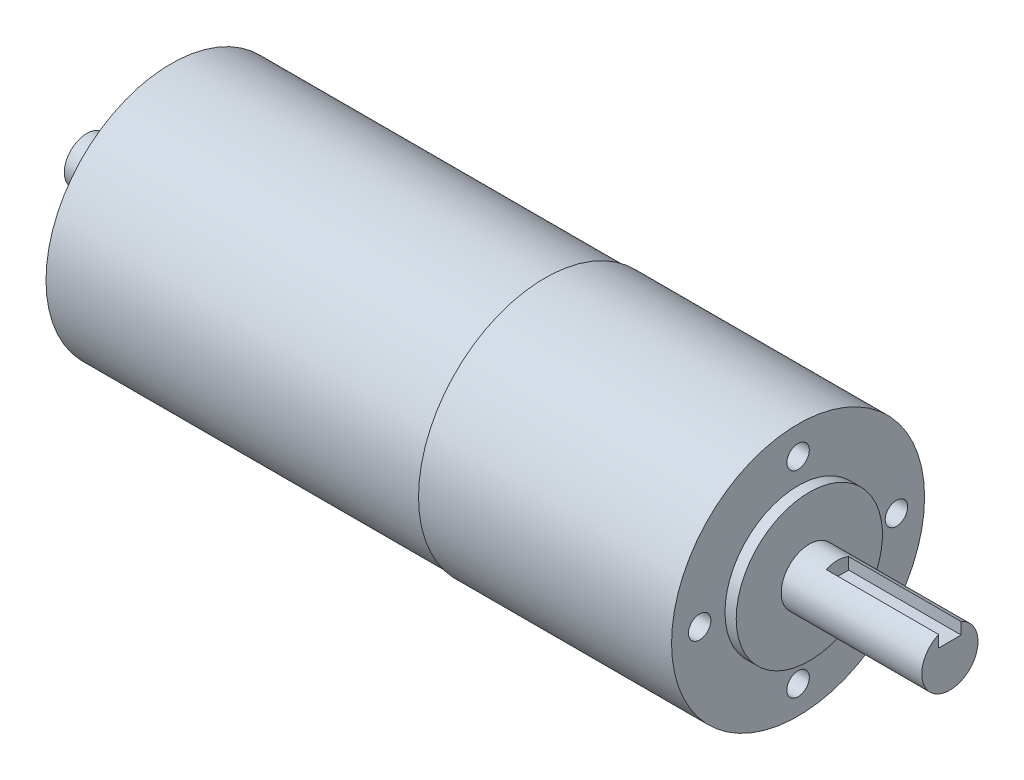
ISO-10303-21;
HEADER;
FILE_DESCRIPTION(('STEP AP214'),'2;1');
FILE_NAME('part.step','',(''),(''),'','','');
FILE_SCHEMA(('AUTOMOTIVE_DESIGN { 1 0 10303 214 1 1 1 1 }'));
ENDSEC;
DATA;
#1=APPLICATION_CONTEXT('core data for automotive mechanical design processes');
#2=APPLICATION_PROTOCOL_DEFINITION('international standard','automotive_design',2000,#1);
#3=PRODUCT_CONTEXT('',#1,'mechanical');
#4=PRODUCT('Part','Part','',(#3));
#5=PRODUCT_RELATED_PRODUCT_CATEGORY('part','',(#4));
#6=PRODUCT_DEFINITION_FORMATION('','',#4);
#7=PRODUCT_DEFINITION_CONTEXT('part definition',#1,'design');
#8=PRODUCT_DEFINITION('design','',#6,#7);
#9=PRODUCT_DEFINITION_SHAPE('','',#8);
#10=(LENGTH_UNIT() NAMED_UNIT(*) SI_UNIT(.MILLI.,.METRE.));
#11=(NAMED_UNIT(*) PLANE_ANGLE_UNIT() SI_UNIT($,.RADIAN.));
#12=(NAMED_UNIT(*) SI_UNIT($,.STERADIAN.) SOLID_ANGLE_UNIT());
#13=UNCERTAINTY_MEASURE_WITH_UNIT(LENGTH_MEASURE(1.E-05),#10,'distance_accuracy_value','');
#14=(GEOMETRIC_REPRESENTATION_CONTEXT(3) GLOBAL_UNCERTAINTY_ASSIGNED_CONTEXT((#13)) GLOBAL_UNIT_ASSIGNED_CONTEXT((#10,
#11,#12)) REPRESENTATION_CONTEXT('',''));
#15=CARTESIAN_POINT('',(0.,0.,0.));
#16=DIRECTION('',(0.,0.,1.));
#17=DIRECTION('',(1.,0.,0.));
#18=AXIS2_PLACEMENT_3D('',#15,#16,#17);
#19=CARTESIAN_POINT('',(-25.,0.,0.));
#20=DIRECTION('',(1.,0.,0.));
#21=DIRECTION('',(0.,0.,-1.));
#22=AXIS2_PLACEMENT_3D('',#19,#20,#21);
#23=CYLINDRICAL_SURFACE('',#22,5.);
#24=DIRECTION('',(1.,0.,0.));
#25=VECTOR('',#24,1.);
#26=CARTESIAN_POINT('',(-25.,4.58257569495584,-2.));
#27=LINE('',#26,#25);
#28=CARTESIAN_POINT('',(0.,4.58257569495584,-2.));
#29=VERTEX_POINT('',#28);
#30=CARTESIAN_POINT('',(-20.,4.58257569495584,-2.));
#31=VERTEX_POINT('',#30);
#32=EDGE_CURVE('E54',#29,#31,#27,.F.);
#33=ORIENTED_EDGE('',*,*,#32,.F.);
#34=CARTESIAN_POINT('',(0.,0.,0.));
#35=DIRECTION('',(1.,0.,0.));
#36=DIRECTION('',(0.,0.,-1.));
#37=AXIS2_PLACEMENT_3D('',#34,#35,#36);
#38=CIRCLE('',#37,5.);
#39=CARTESIAN_POINT('',(0.,4.58257569495584,2.));
#40=VERTEX_POINT('',#39);
#41=EDGE_CURVE('E142',#40,#29,#38,.T.);
#42=ORIENTED_EDGE('',*,*,#41,.F.);
#43=DIRECTION('',(1.,0.,0.));
#44=VECTOR('',#43,1.);
#45=CARTESIAN_POINT('',(-25.,4.58257569495584,2.));
#46=LINE('',#45,#44);
#47=CARTESIAN_POINT('',(-20.,4.58257569495584,2.));
#48=VERTEX_POINT('',#47);
#49=EDGE_CURVE('E46',#48,#40,#46,.T.);
#50=ORIENTED_EDGE('',*,*,#49,.F.);
#51=CARTESIAN_POINT('',(-20.,0.,0.));
#52=DIRECTION('',(1.,0.,0.));
#53=DIRECTION('',(0.,0.,-1.));
#54=AXIS2_PLACEMENT_3D('',#51,#52,#53);
#55=CIRCLE('',#54,5.);
#56=EDGE_CURVE('E11',#48,#31,#55,.F.);
#57=ORIENTED_EDGE('',*,*,#56,.T.);
#58=EDGE_LOOP('',(#33,#42,#50,#57));
#59=FACE_BOUND('',#58,.T.);
#60=CARTESIAN_POINT('',(-25.,0.,0.));
#61=DIRECTION('',(1.,0.,0.));
#62=DIRECTION('',(0.,0.,-1.));
#63=AXIS2_PLACEMENT_3D('',#60,#61,#62);
#64=CIRCLE('',#63,5.);
#65=CARTESIAN_POINT('',(-25.,0.,-5.));
#66=VERTEX_POINT('',#65);
#67=EDGE_CURVE('E152',#66,#66,#64,.T.);
#68=ORIENTED_EDGE('',*,*,#67,.T.);
#69=EDGE_LOOP('',(#68));
#70=FACE_BOUND('',#69,.T.);
#71=ADVANCED_FACE('F32',(#59,#70),#23,.T.);
#72=CARTESIAN_POINT('',(0.,0.,0.));
#73=DIRECTION('',(1.,0.,0.));
#74=DIRECTION('',(0.,0.,-1.));
#75=AXIS2_PLACEMENT_3D('',#72,#73,#74);
#76=PLANE('',#75);
#77=DIRECTION('',(0.,1.,0.));
#78=VECTOR('',#77,1.);
#79=CARTESIAN_POINT('',(0.,5.,-2.));
#80=LINE('',#79,#78);
#81=CARTESIAN_POINT('',(0.,2.5,-2.));
#82=VERTEX_POINT('',#81);
#83=EDGE_CURVE('E92',#82,#29,#80,.T.);
#84=ORIENTED_EDGE('',*,*,#83,.F.);
#85=DIRECTION('',(0.,0.,-1.));
#86=VECTOR('',#85,1.);
#87=CARTESIAN_POINT('',(0.,2.5,2.));
#88=LINE('',#87,#86);
#89=CARTESIAN_POINT('',(0.,2.5,2.));
#90=VERTEX_POINT('',#89);
#91=EDGE_CURVE('E94',#90,#82,#88,.T.);
#92=ORIENTED_EDGE('',*,*,#91,.F.);
#93=DIRECTION('',(0.,-1.,0.));
#94=VECTOR('',#93,1.);
#95=CARTESIAN_POINT('',(0.,0.,2.));
#96=LINE('',#95,#94);
#97=EDGE_CURVE('E39',#40,#90,#96,.T.);
#98=ORIENTED_EDGE('',*,*,#97,.F.);
#99=ORIENTED_EDGE('',*,*,#41,.T.);
#100=EDGE_LOOP('',(#84,#92,#98,#99));
#101=FACE_BOUND('',#100,.T.);
#102=ADVANCED_FACE('F161',(#101),#76,.T.);
#103=CARTESIAN_POINT('',(-27.,0.,0.));
#104=DIRECTION('',(1.,0.,0.));
#105=DIRECTION('',(0.,0.,-1.));
#106=AXIS2_PLACEMENT_3D('',#103,#104,#105);
#107=CYLINDRICAL_SURFACE('',#106,13.);
#108=CARTESIAN_POINT('',(-27.,0.,0.));
#109=DIRECTION('',(-1.,0.,0.));
#110=DIRECTION('',(0.,0.,1.));
#111=AXIS2_PLACEMENT_3D('',#108,#109,#110);
#112=CIRCLE('',#111,13.);
#113=CARTESIAN_POINT('',(-27.,0.,13.));
#114=VERTEX_POINT('',#113);
#115=EDGE_CURVE('E149',#114,#114,#112,.T.);
#116=ORIENTED_EDGE('',*,*,#115,.F.);
#117=EDGE_LOOP('',(#116));
#118=FACE_BOUND('',#117,.T.);
#119=CARTESIAN_POINT('',(-25.,0.,0.));
#120=DIRECTION('',(-1.,0.,0.));
#121=DIRECTION('',(0.,0.,1.));
#122=AXIS2_PLACEMENT_3D('',#119,#120,#121);
#123=CIRCLE('',#122,13.);
#124=CARTESIAN_POINT('',(-25.,0.,13.));
#125=VERTEX_POINT('',#124);
#126=EDGE_CURVE('E146',#125,#125,#123,.T.);
#127=ORIENTED_EDGE('',*,*,#126,.T.);
#128=EDGE_LOOP('',(#127));
#129=FACE_BOUND('',#128,.T.);
#130=ADVANCED_FACE('F171',(#118,#129),#107,.T.);
#131=CARTESIAN_POINT('',(-25.,0.,0.));
#132=DIRECTION('',(-1.,0.,0.));
#133=DIRECTION('',(0.,0.,1.));
#134=AXIS2_PLACEMENT_3D('',#131,#132,#133);
#135=PLANE('',#134);
#136=ORIENTED_EDGE('',*,*,#67,.F.);
#137=EDGE_LOOP('',(#136));
#138=FACE_BOUND('',#137,.T.);
#139=ORIENTED_EDGE('',*,*,#126,.F.);
#140=EDGE_LOOP('',(#139));
#141=FACE_BOUND('',#140,.T.);
#142=ADVANCED_FACE('F167',(#138,#141),#135,.F.);
#143=CARTESIAN_POINT('',(-72.,0.,0.));
#144=DIRECTION('',(1.,0.,0.));
#145=DIRECTION('',(0.,0.,-1.));
#146=AXIS2_PLACEMENT_3D('',#143,#144,#145);
#147=CYLINDRICAL_SURFACE('',#146,22.5);
#148=CARTESIAN_POINT('',(-72.,0.,0.));
#149=DIRECTION('',(-1.,0.,0.));
#150=DIRECTION('',(0.,0.,1.));
#151=AXIS2_PLACEMENT_3D('',#148,#149,#150);
#152=CIRCLE('',#151,22.5);
#153=CARTESIAN_POINT('',(-72.,0.,-22.5));
#154=VERTEX_POINT('',#153);
#155=EDGE_CURVE('E143',#154,#154,#152,.T.);
#156=CARTESIAN_POINT('',(-27.,0.,0.));
#157=DIRECTION('',(-1.,0.,0.));
#158=DIRECTION('',(0.,0.,1.));
#159=AXIS2_PLACEMENT_3D('',#156,#157,#158);
#160=CIRCLE('',#159,22.5);
#161=CARTESIAN_POINT('',(-27.,0.,-22.5));
#162=VERTEX_POINT('',#161);
#163=EDGE_CURVE('E139',#162,#162,#160,.T.);
#164=CARTESIAN_POINT('',(-72.,0.,-22.5));
#165=CARTESIAN_POINT('',(-71.53125,0.,-22.5));
#166=CARTESIAN_POINT('',(-71.0625,0.,-22.5));
#167=CARTESIAN_POINT('',(-70.125,0.,-22.5));
#168=CARTESIAN_POINT('',(-69.65625,0.,-22.5));
#169=CARTESIAN_POINT('',(-68.71875,0.,-22.5));
#170=CARTESIAN_POINT('',(-68.25,0.,-22.5));
#171=CARTESIAN_POINT('',(-67.3125,0.,-22.5));
#172=CARTESIAN_POINT('',(-66.84375,0.,-22.5));
#173=CARTESIAN_POINT('',(-65.90625,0.,-22.5));
#174=CARTESIAN_POINT('',(-65.4375,0.,-22.5));
#175=CARTESIAN_POINT('',(-64.5,0.,-22.5));
#176=CARTESIAN_POINT('',(-64.03125,0.,-22.5));
#177=CARTESIAN_POINT('',(-63.09375,0.,-22.5));
#178=CARTESIAN_POINT('',(-62.625,0.,-22.5));
#179=CARTESIAN_POINT('',(-61.6875,0.,-22.5));
#180=CARTESIAN_POINT('',(-61.21875,0.,-22.5));
#181=CARTESIAN_POINT('',(-60.28125,0.,-22.5));
#182=CARTESIAN_POINT('',(-59.8125,0.,-22.5));
#183=CARTESIAN_POINT('',(-58.875,0.,-22.5));
#184=CARTESIAN_POINT('',(-58.40625,0.,-22.5));
#185=CARTESIAN_POINT('',(-57.46875,0.,-22.5));
#186=CARTESIAN_POINT('',(-57.,0.,-22.5));
#187=CARTESIAN_POINT('',(-56.0625,0.,-22.5));
#188=CARTESIAN_POINT('',(-55.59375,0.,-22.5));
#189=CARTESIAN_POINT('',(-54.65625,0.,-22.5));
#190=CARTESIAN_POINT('',(-54.1875,0.,-22.5));
#191=CARTESIAN_POINT('',(-53.25,0.,-22.5));
#192=CARTESIAN_POINT('',(-52.78125,0.,-22.5));
#193=CARTESIAN_POINT('',(-51.84375,0.,-22.5));
#194=CARTESIAN_POINT('',(-51.375,0.,-22.5));
#195=CARTESIAN_POINT('',(-50.4375,0.,-22.5));
#196=CARTESIAN_POINT('',(-49.96875,0.,-22.5));
#197=CARTESIAN_POINT('',(-49.03125,0.,-22.5));
#198=CARTESIAN_POINT('',(-48.5625,0.,-22.5));
#199=CARTESIAN_POINT('',(-47.625,0.,-22.5));
#200=CARTESIAN_POINT('',(-47.15625,0.,-22.5));
#201=CARTESIAN_POINT('',(-46.21875,0.,-22.5));
#202=CARTESIAN_POINT('',(-45.75,0.,-22.5));
#203=CARTESIAN_POINT('',(-44.8125,0.,-22.5));
#204=CARTESIAN_POINT('',(-44.34375,0.,-22.5));
#205=CARTESIAN_POINT('',(-43.40625,0.,-22.5));
#206=CARTESIAN_POINT('',(-42.9375,0.,-22.5));
#207=CARTESIAN_POINT('',(-42.,0.,-22.5));
#208=CARTESIAN_POINT('',(-41.53125,0.,-22.5));
#209=CARTESIAN_POINT('',(-40.59375,0.,-22.5));
#210=CARTESIAN_POINT('',(-40.125,0.,-22.5));
#211=CARTESIAN_POINT('',(-39.1875,0.,-22.5));
#212=CARTESIAN_POINT('',(-38.71875,0.,-22.5));
#213=CARTESIAN_POINT('',(-37.78125,0.,-22.5));
#214=CARTESIAN_POINT('',(-37.3125,0.,-22.5));
#215=CARTESIAN_POINT('',(-36.375,0.,-22.5));
#216=CARTESIAN_POINT('',(-35.90625,0.,-22.5));
#217=CARTESIAN_POINT('',(-34.96875,0.,-22.5));
#218=CARTESIAN_POINT('',(-34.5,0.,-22.5));
#219=CARTESIAN_POINT('',(-33.5625,0.,-22.5));
#220=CARTESIAN_POINT('',(-33.09375,0.,-22.5));
#221=CARTESIAN_POINT('',(-32.15625,0.,-22.5));
#222=CARTESIAN_POINT('',(-31.6875,0.,-22.5));
#223=CARTESIAN_POINT('',(-30.75,0.,-22.5));
#224=CARTESIAN_POINT('',(-30.28125,0.,-22.5));
#225=CARTESIAN_POINT('',(-29.34375,0.,-22.5));
#226=CARTESIAN_POINT('',(-28.875,0.,-22.5));
#227=CARTESIAN_POINT('',(-27.9375,0.,-22.5));
#228=CARTESIAN_POINT('',(-27.46875,0.,-22.5));
#229=CARTESIAN_POINT('',(-27.,0.,-22.5));
#230=B_SPLINE_CURVE_WITH_KNOTS('',3,(#164,#165,#166,#167,#168,#169,#170,#171,#172,#173,#174,
#175,#176,#177,#178,#179,#180,#181,#182,#183,#184,#185,#186,#187,#188,#189,#190,#191,#192,#193,
#194,#195,#196,#197,#198,#199,#200,#201,#202,#203,#204,#205,#206,#207,#208,#209,#210,#211,#212,
#213,#214,#215,#216,#217,#218,#219,#220,#221,#222,#223,#224,#225,#226,#227,#228,#229),
.UNSPECIFIED.,.F.,.F.,(4,2,2,2,2,2,2,2,2,2,2,2,2,2,2,2,2,2,2,2,2,2,2,2,2,2,2,2,2,2,2,2,4),(0.,
1.40625,2.8125,4.21874999999999,5.62499999999999,7.03124999999999,8.43749999999999,
9.84374999999999,11.25,12.65625,14.0625,15.46875,16.875,18.28125,19.6875,21.09375,22.5,23.90625,
25.3125,26.71875,28.125,29.53125,30.9375,32.34375,33.75,35.15625,36.5625,37.96875,39.375,
40.78125,42.1875,43.59375,45.),.UNSPECIFIED.);
#231=EDGE_CURVE('BSEAM170',#154,#162,#230,.T.);
#232=ORIENTED_EDGE('',*,*,#155,.F.);
#233=ORIENTED_EDGE('',*,*,#163,.T.);
#234=ORIENTED_EDGE('',*,*,#231,.T.);
#235=ORIENTED_EDGE('',*,*,#231,.F.);
#236=EDGE_LOOP('',(#232,#234,#233,#235));
#237=FACE_BOUND('',#236,.T.);
#238=ADVANCED_FACE('F170',(#237),#147,.T.);
#239=CARTESIAN_POINT('',(-72.,0.,0.));
#240=DIRECTION('',(-1.,0.,0.));
#241=DIRECTION('',(0.,0.,1.));
#242=AXIS2_PLACEMENT_3D('',#239,#240,#241);
#243=PLANE('',#242);
#244=CARTESIAN_POINT('',(-72.,0.,0.));
#245=DIRECTION('',(-1.,0.,0.));
#246=DIRECTION('',(0.,0.,1.));
#247=AXIS2_PLACEMENT_3D('',#244,#245,#246);
#248=CIRCLE('',#247,22.25);
#249=CARTESIAN_POINT('',(-72.,0.,22.25));
#250=VERTEX_POINT('',#249);
#251=EDGE_CURVE('E136',#250,#250,#248,.T.);
#252=ORIENTED_EDGE('',*,*,#251,.F.);
#253=EDGE_LOOP('',(#252));
#254=FACE_BOUND('',#253,.T.);
#255=ORIENTED_EDGE('',*,*,#155,.T.);
#256=EDGE_LOOP('',(#255));
#257=FACE_BOUND('',#256,.T.);
#258=ADVANCED_FACE('F185',(#254,#257),#243,.T.);
#259=CARTESIAN_POINT('',(-27.,0.,0.));
#260=DIRECTION('',(-1.,0.,0.));
#261=DIRECTION('',(0.,0.,1.));
#262=AXIS2_PLACEMENT_3D('',#259,#260,#261);
#263=PLANE('',#262);
#264=CARTESIAN_POINT('',(-27.,17.5,0.));
#265=DIRECTION('',(1.,0.,0.));
#266=DIRECTION('',(0.,0.,-1.));
#267=AXIS2_PLACEMENT_3D('',#264,#265,#266);
#268=CIRCLE('',#267,2.);
#269=CARTESIAN_POINT('',(-27.,17.5,-2.));
#270=VERTEX_POINT('',#269);
#271=EDGE_CURVE('E104',#270,#270,#268,.T.);
#272=ORIENTED_EDGE('',*,*,#271,.F.);
#273=EDGE_LOOP('',(#272));
#274=FACE_BOUND('',#273,.T.);
#275=CARTESIAN_POINT('',(-27.,4.94165217184308E-13,-17.5000000000005));
#276=DIRECTION('',(1.,0.,0.));
#277=DIRECTION('',(0.,0.,-1.));
#278=AXIS2_PLACEMENT_3D('',#275,#276,#277);
#279=CIRCLE('',#278,2.00000000000039);
#280=CARTESIAN_POINT('',(-27.,4.94165217184308E-13,-19.5000000000009));
#281=VERTEX_POINT('',#280);
#282=EDGE_CURVE('E110',#281,#281,#279,.T.);
#283=ORIENTED_EDGE('',*,*,#282,.F.);
#284=EDGE_LOOP('',(#283));
#285=FACE_BOUND('',#284,.T.);
#286=CARTESIAN_POINT('',(-27.,-17.5,-9.88330434368617E-13));
#287=DIRECTION('',(1.,0.,0.));
#288=DIRECTION('',(0.,0.,-1.));
#289=AXIS2_PLACEMENT_3D('',#286,#287,#288);
#290=CIRCLE('',#289,2.00000000000106);
#291=CARTESIAN_POINT('',(-27.,-17.5,-2.00000000000205));
#292=VERTEX_POINT('',#291);
#293=EDGE_CURVE('E116',#292,#292,#290,.T.);
#294=ORIENTED_EDGE('',*,*,#293,.F.);
#295=EDGE_LOOP('',(#294));
#296=FACE_BOUND('',#295,.T.);
#297=CARTESIAN_POINT('',(-27.,-4.96308349082816E-13,17.4999999999995));
#298=DIRECTION('',(1.,0.,0.));
#299=DIRECTION('',(0.,0.,-1.));
#300=AXIS2_PLACEMENT_3D('',#297,#298,#299);
#301=CIRCLE('',#300,2.00000000000079);
#302=CARTESIAN_POINT('',(-27.,-4.96308349082816E-13,15.4999999999987));
#303=VERTEX_POINT('',#302);
#304=EDGE_CURVE('E99',#303,#303,#301,.T.);
#305=ORIENTED_EDGE('',*,*,#304,.F.);
#306=EDGE_LOOP('',(#305));
#307=FACE_BOUND('',#306,.T.);
#308=ORIENTED_EDGE('',*,*,#115,.T.);
#309=EDGE_LOOP('',(#308));
#310=FACE_BOUND('',#309,.T.);
#311=ORIENTED_EDGE('',*,*,#163,.F.);
#312=EDGE_LOOP('',(#311));
#313=FACE_BOUND('',#312,.T.);
#314=ADVANCED_FACE('F187',(#274,#285,#296,#307,#310,#313),#263,.F.);
#315=CARTESIAN_POINT('',(-138.5,0.,0.));
#316=DIRECTION('',(1.,0.,0.));
#317=DIRECTION('',(0.,0.,-1.));
#318=AXIS2_PLACEMENT_3D('',#315,#316,#317);
#319=CYLINDRICAL_SURFACE('',#318,22.25);
#320=CARTESIAN_POINT('',(-138.5,0.,0.));
#321=DIRECTION('',(-1.,0.,0.));
#322=DIRECTION('',(0.,0.,1.));
#323=AXIS2_PLACEMENT_3D('',#320,#321,#322);
#324=CIRCLE('',#323,22.25);
#325=CARTESIAN_POINT('',(-138.5,0.,22.25));
#326=VERTEX_POINT('',#325);
#327=EDGE_CURVE('E133',#326,#326,#324,.T.);
#328=ORIENTED_EDGE('',*,*,#327,.F.);
#329=EDGE_LOOP('',(#328));
#330=FACE_BOUND('',#329,.T.);
#331=ORIENTED_EDGE('',*,*,#251,.T.);
#332=EDGE_LOOP('',(#331));
#333=FACE_BOUND('',#332,.T.);
#334=ADVANCED_FACE('F190',(#330,#333),#319,.T.);
#335=CARTESIAN_POINT('',(-138.5,0.,0.));
#336=DIRECTION('',(-1.,0.,0.));
#337=DIRECTION('',(0.,0.,1.));
#338=AXIS2_PLACEMENT_3D('',#335,#336,#337);
#339=PLANE('',#338);
#340=CARTESIAN_POINT('',(-138.5,0.,0.));
#341=DIRECTION('',(-1.,0.,0.));
#342=DIRECTION('',(0.,0.,1.));
#343=AXIS2_PLACEMENT_3D('',#340,#341,#342);
#344=CIRCLE('',#343,10.);
#345=CARTESIAN_POINT('',(-138.5,0.,10.));
#346=VERTEX_POINT('',#345);
#347=EDGE_CURVE('E130',#346,#346,#344,.T.);
#348=ORIENTED_EDGE('',*,*,#347,.F.);
#349=EDGE_LOOP('',(#348));
#350=FACE_BOUND('',#349,.T.);
#351=ORIENTED_EDGE('',*,*,#327,.T.);
#352=EDGE_LOOP('',(#351));
#353=FACE_BOUND('',#352,.T.);
#354=ADVANCED_FACE('F197',(#350,#353),#339,.T.);
#355=CARTESIAN_POINT('',(-143.5,0.,0.));
#356=DIRECTION('',(1.,0.,0.));
#357=DIRECTION('',(0.,0.,-1.));
#358=AXIS2_PLACEMENT_3D('',#355,#356,#357);
#359=CYLINDRICAL_SURFACE('',#358,10.);
#360=CARTESIAN_POINT('',(-143.5,0.,0.));
#361=DIRECTION('',(-1.,0.,0.));
#362=DIRECTION('',(0.,0.,1.));
#363=AXIS2_PLACEMENT_3D('',#360,#361,#362);
#364=CIRCLE('',#363,10.);
#365=CARTESIAN_POINT('',(-143.5,0.,10.));
#366=VERTEX_POINT('',#365);
#367=EDGE_CURVE('E126',#366,#366,#364,.T.);
#368=ORIENTED_EDGE('',*,*,#367,.F.);
#369=EDGE_LOOP('',(#368));
#370=FACE_BOUND('',#369,.T.);
#371=ORIENTED_EDGE('',*,*,#347,.T.);
#372=EDGE_LOOP('',(#371));
#373=FACE_BOUND('',#372,.T.);
#374=ADVANCED_FACE('F201',(#370,#373),#359,.T.);
#375=CARTESIAN_POINT('',(-143.5,0.,0.));
#376=DIRECTION('',(-1.,0.,0.));
#377=DIRECTION('',(0.,0.,1.));
#378=AXIS2_PLACEMENT_3D('',#375,#376,#377);
#379=PLANE('',#378);
#380=CARTESIAN_POINT('',(-143.5,0.,0.));
#381=DIRECTION('',(-1.,0.,0.));
#382=DIRECTION('',(0.,0.,1.));
#383=AXIS2_PLACEMENT_3D('',#380,#381,#382);
#384=CIRCLE('',#383,4.);
#385=CARTESIAN_POINT('',(-143.5,0.,4.));
#386=VERTEX_POINT('',#385);
#387=EDGE_CURVE('E127',#386,#386,#384,.T.);
#388=ORIENTED_EDGE('',*,*,#387,.F.);
#389=EDGE_LOOP('',(#388));
#390=FACE_BOUND('',#389,.T.);
#391=ORIENTED_EDGE('',*,*,#367,.T.);
#392=EDGE_LOOP('',(#391));
#393=FACE_BOUND('',#392,.T.);
#394=ADVANCED_FACE('F205',(#390,#393),#379,.T.);
#395=CARTESIAN_POINT('',(-153.5,0.,0.));
#396=DIRECTION('',(1.,0.,0.));
#397=DIRECTION('',(0.,0.,-1.));
#398=AXIS2_PLACEMENT_3D('',#395,#396,#397);
#399=CYLINDRICAL_SURFACE('',#398,4.);
#400=CARTESIAN_POINT('',(-153.5,0.,0.));
#401=DIRECTION('',(-1.,0.,0.));
#402=DIRECTION('',(0.,0.,1.));
#403=AXIS2_PLACEMENT_3D('',#400,#401,#402);
#404=CIRCLE('',#403,4.);
#405=CARTESIAN_POINT('',(-153.5,0.,4.));
#406=VERTEX_POINT('',#405);
#407=EDGE_CURVE('E103',#406,#406,#404,.T.);
#408=ORIENTED_EDGE('',*,*,#407,.F.);
#409=EDGE_LOOP('',(#408));
#410=FACE_BOUND('',#409,.T.);
#411=ORIENTED_EDGE('',*,*,#387,.T.);
#412=EDGE_LOOP('',(#411));
#413=FACE_BOUND('',#412,.T.);
#414=ADVANCED_FACE('F209',(#410,#413),#399,.T.);
#415=CARTESIAN_POINT('',(-153.5,0.,0.));
#416=DIRECTION('',(-1.,0.,0.));
#417=DIRECTION('',(0.,0.,1.));
#418=AXIS2_PLACEMENT_3D('',#415,#416,#417);
#419=PLANE('',#418);
#420=ORIENTED_EDGE('',*,*,#407,.T.);
#421=EDGE_LOOP('',(#420));
#422=FACE_BOUND('',#421,.T.);
#423=ADVANCED_FACE('F213',(#422),#419,.T.);
#424=CARTESIAN_POINT('',(-36.,-4.96308349082816E-13,17.4999999999995));
#425=DIRECTION('',(1.,0.,0.));
#426=DIRECTION('',(0.,0.,-1.));
#427=AXIS2_PLACEMENT_3D('',#424,#425,#426);
#428=CYLINDRICAL_SURFACE('',#427,2.00000000000079);
#429=CARTESIAN_POINT('',(-36.,-4.96308349082816E-13,17.4999999999995));
#430=DIRECTION('',(1.,0.,0.));
#431=DIRECTION('',(0.,0.,-1.));
#432=AXIS2_PLACEMENT_3D('',#429,#430,#431);
#433=CIRCLE('',#432,2.00000000000079);
#434=CARTESIAN_POINT('',(-36.,-4.96308349082816E-13,15.4999999999987));
#435=VERTEX_POINT('',#434);
#436=EDGE_CURVE('E119',#435,#435,#433,.T.);
#437=ORIENTED_EDGE('',*,*,#436,.F.);
#438=EDGE_LOOP('',(#437));
#439=FACE_BOUND('',#438,.T.);
#440=ORIENTED_EDGE('',*,*,#304,.T.);
#441=EDGE_LOOP('',(#440));
#442=FACE_BOUND('',#441,.T.);
#443=ADVANCED_FACE('F217',(#439,#442),#428,.F.);
#444=CARTESIAN_POINT('',(-36.,-4.96308349082816E-13,17.4999999999995));
#445=DIRECTION('',(1.,0.,0.));
#446=DIRECTION('',(0.,0.,-1.));
#447=AXIS2_PLACEMENT_3D('',#444,#445,#446);
#448=PLANE('',#447);
#449=ORIENTED_EDGE('',*,*,#436,.T.);
#450=EDGE_LOOP('',(#449));
#451=FACE_BOUND('',#450,.T.);
#452=ADVANCED_FACE('F221',(#451),#448,.T.);
#453=CARTESIAN_POINT('',(-36.,-17.5,-9.88330434368617E-13));
#454=DIRECTION('',(1.,0.,0.));
#455=DIRECTION('',(0.,0.,-1.));
#456=AXIS2_PLACEMENT_3D('',#453,#454,#455);
#457=CYLINDRICAL_SURFACE('',#456,2.00000000000106);
#458=CARTESIAN_POINT('',(-36.,-17.5,-9.88330434368617E-13));
#459=DIRECTION('',(1.,0.,0.));
#460=DIRECTION('',(0.,0.,-1.));
#461=AXIS2_PLACEMENT_3D('',#458,#459,#460);
#462=CIRCLE('',#461,2.00000000000106);
#463=CARTESIAN_POINT('',(-36.,-17.5,-2.00000000000205));
#464=VERTEX_POINT('',#463);
#465=EDGE_CURVE('E113',#464,#464,#462,.T.);
#466=ORIENTED_EDGE('',*,*,#465,.F.);
#467=EDGE_LOOP('',(#466));
#468=FACE_BOUND('',#467,.T.);
#469=ORIENTED_EDGE('',*,*,#293,.T.);
#470=EDGE_LOOP('',(#469));
#471=FACE_BOUND('',#470,.T.);
#472=ADVANCED_FACE('F225',(#468,#471),#457,.F.);
#473=CARTESIAN_POINT('',(-36.,-17.5,-9.88330434368617E-13));
#474=DIRECTION('',(1.,0.,0.));
#475=DIRECTION('',(0.,0.,-1.));
#476=AXIS2_PLACEMENT_3D('',#473,#474,#475);
#477=PLANE('',#476);
#478=ORIENTED_EDGE('',*,*,#465,.T.);
#479=EDGE_LOOP('',(#478));
#480=FACE_BOUND('',#479,.T.);
#481=ADVANCED_FACE('F229',(#480),#477,.T.);
#482=CARTESIAN_POINT('',(-36.,4.94165217184308E-13,-17.5000000000005));
#483=DIRECTION('',(1.,0.,0.));
#484=DIRECTION('',(0.,0.,-1.));
#485=AXIS2_PLACEMENT_3D('',#482,#483,#484);
#486=CYLINDRICAL_SURFACE('',#485,2.00000000000039);
#487=CARTESIAN_POINT('',(-36.,4.94165217184308E-13,-17.5000000000005));
#488=DIRECTION('',(1.,0.,0.));
#489=DIRECTION('',(0.,0.,-1.));
#490=AXIS2_PLACEMENT_3D('',#487,#488,#489);
#491=CIRCLE('',#490,2.00000000000039);
#492=CARTESIAN_POINT('',(-36.,4.94165217184308E-13,-19.5000000000009));
#493=VERTEX_POINT('',#492);
#494=EDGE_CURVE('E107',#493,#493,#491,.T.);
#495=ORIENTED_EDGE('',*,*,#494,.F.);
#496=EDGE_LOOP('',(#495));
#497=FACE_BOUND('',#496,.T.);
#498=ORIENTED_EDGE('',*,*,#282,.T.);
#499=EDGE_LOOP('',(#498));
#500=FACE_BOUND('',#499,.T.);
#501=ADVANCED_FACE('F233',(#497,#500),#486,.F.);
#502=CARTESIAN_POINT('',(-36.,4.94165217184308E-13,-17.5000000000005));
#503=DIRECTION('',(1.,0.,0.));
#504=DIRECTION('',(0.,0.,-1.));
#505=AXIS2_PLACEMENT_3D('',#502,#503,#504);
#506=PLANE('',#505);
#507=ORIENTED_EDGE('',*,*,#494,.T.);
#508=EDGE_LOOP('',(#507));
#509=FACE_BOUND('',#508,.T.);
#510=ADVANCED_FACE('F237',(#509),#506,.T.);
#511=CARTESIAN_POINT('',(-36.,17.5,0.));
#512=DIRECTION('',(1.,0.,0.));
#513=DIRECTION('',(0.,0.,-1.));
#514=AXIS2_PLACEMENT_3D('',#511,#512,#513);
#515=CYLINDRICAL_SURFACE('',#514,2.);
#516=CARTESIAN_POINT('',(-36.,17.5,0.));
#517=DIRECTION('',(1.,0.,0.));
#518=DIRECTION('',(0.,0.,-1.));
#519=AXIS2_PLACEMENT_3D('',#516,#517,#518);
#520=CIRCLE('',#519,2.);
#521=CARTESIAN_POINT('',(-36.,17.5,-2.));
#522=VERTEX_POINT('',#521);
#523=EDGE_CURVE('E100',#522,#522,#520,.T.);
#524=ORIENTED_EDGE('',*,*,#523,.F.);
#525=EDGE_LOOP('',(#524));
#526=FACE_BOUND('',#525,.T.);
#527=ORIENTED_EDGE('',*,*,#271,.T.);
#528=EDGE_LOOP('',(#527));
#529=FACE_BOUND('',#528,.T.);
#530=ADVANCED_FACE('F241',(#526,#529),#515,.F.);
#531=CARTESIAN_POINT('',(-36.,17.5,0.));
#532=DIRECTION('',(1.,0.,0.));
#533=DIRECTION('',(0.,0.,-1.));
#534=AXIS2_PLACEMENT_3D('',#531,#532,#533);
#535=PLANE('',#534);
#536=ORIENTED_EDGE('',*,*,#523,.T.);
#537=EDGE_LOOP('',(#536));
#538=FACE_BOUND('',#537,.T.);
#539=ADVANCED_FACE('F245',(#538),#535,.T.);
#540=CARTESIAN_POINT('',(-20.,5.,-2.));
#541=DIRECTION('',(0.,0.,-1.));
#542=DIRECTION('',(0.,1.,0.));
#543=AXIS2_PLACEMENT_3D('',#540,#541,#542);
#544=PLANE('',#543);
#545=ORIENTED_EDGE('',*,*,#32,.T.);
#546=DIRECTION('',(0.,1.,0.));
#547=VECTOR('',#546,1.);
#548=CARTESIAN_POINT('',(-20.,5.,-2.));
#549=LINE('',#548,#547);
#550=CARTESIAN_POINT('',(-20.,2.5,-2.));
#551=VERTEX_POINT('',#550);
#552=EDGE_CURVE('E78',#551,#31,#549,.T.);
#553=ORIENTED_EDGE('',*,*,#552,.F.);
#554=DIRECTION('',(1.,0.,0.));
#555=VECTOR('',#554,1.);
#556=CARTESIAN_POINT('',(-20.,2.5,-2.));
#557=LINE('',#556,#555);
#558=EDGE_CURVE('E86',#551,#82,#557,.T.);
#559=ORIENTED_EDGE('',*,*,#558,.T.);
#560=ORIENTED_EDGE('',*,*,#83,.T.);
#561=EDGE_LOOP('',(#545,#553,#559,#560));
#562=FACE_BOUND('',#561,.T.);
#563=ADVANCED_FACE('F249',(#562),#544,.F.);
#564=CARTESIAN_POINT('',(-20.,2.5,2.));
#565=DIRECTION('',(0.,-1.,0.));
#566=DIRECTION('',(0.,0.,-1.));
#567=AXIS2_PLACEMENT_3D('',#564,#565,#566);
#568=PLANE('',#567);
#569=ORIENTED_EDGE('',*,*,#91,.T.);
#570=ORIENTED_EDGE('',*,*,#558,.F.);
#571=DIRECTION('',(0.,0.,-1.));
#572=VECTOR('',#571,1.);
#573=CARTESIAN_POINT('',(-20.,2.5,2.));
#574=LINE('',#573,#572);
#575=CARTESIAN_POINT('',(-20.,2.5,2.));
#576=VERTEX_POINT('',#575);
#577=EDGE_CURVE('E77',#576,#551,#574,.T.);
#578=ORIENTED_EDGE('',*,*,#577,.F.);
#579=DIRECTION('',(1.,0.,0.));
#580=VECTOR('',#579,1.);
#581=CARTESIAN_POINT('',(-20.,2.5,2.));
#582=LINE('',#581,#580);
#583=EDGE_CURVE('E81',#576,#90,#582,.T.);
#584=ORIENTED_EDGE('',*,*,#583,.T.);
#585=EDGE_LOOP('',(#569,#570,#578,#584));
#586=FACE_BOUND('',#585,.T.);
#587=ADVANCED_FACE('F88',(#586),#568,.F.);
#588=CARTESIAN_POINT('',(-20.,5.,2.));
#589=DIRECTION('',(0.,0.,1.));
#590=DIRECTION('',(0.,-1.,0.));
#591=AXIS2_PLACEMENT_3D('',#588,#589,#590);
#592=PLANE('',#591);
#593=ORIENTED_EDGE('',*,*,#49,.T.);
#594=ORIENTED_EDGE('',*,*,#97,.T.);
#595=ORIENTED_EDGE('',*,*,#583,.F.);
#596=DIRECTION('',(0.,-1.,0.));
#597=VECTOR('',#596,1.);
#598=CARTESIAN_POINT('',(-20.,5.,2.));
#599=LINE('',#598,#597);
#600=EDGE_CURVE('E73',#48,#576,#599,.T.);
#601=ORIENTED_EDGE('',*,*,#600,.F.);
#602=EDGE_LOOP('',(#593,#594,#595,#601));
#603=FACE_BOUND('',#602,.T.);
#604=ADVANCED_FACE('F82',(#603),#592,.F.);
#605=CARTESIAN_POINT('',(-20.,0.,0.));
#606=DIRECTION('',(1.,0.,0.));
#607=DIRECTION('',(0.,0.,-1.));
#608=AXIS2_PLACEMENT_3D('',#605,#606,#607);
#609=PLANE('',#608);
#610=ORIENTED_EDGE('',*,*,#600,.T.);
#611=ORIENTED_EDGE('',*,*,#577,.T.);
#612=ORIENTED_EDGE('',*,*,#552,.T.);
#613=ORIENTED_EDGE('',*,*,#56,.F.);
#614=EDGE_LOOP('',(#610,#611,#612,#613));
#615=FACE_BOUND('',#614,.T.);
#616=ADVANCED_FACE('F75',(#615),#609,.T.);
#617=CLOSED_SHELL('',(#71,#102,#130,#142,#238,#258,#314,#334,#354,#374,#394,#414,#423,#443,#452,
#472,#481,#501,#510,#530,#539,#563,#587,#604,#616));
#618=MANIFOLD_SOLID_BREP('B2',#617);
#619=ADVANCED_BREP_SHAPE_REPRESENTATION('',(#18,#618),#14);
#620=SHAPE_DEFINITION_REPRESENTATION(#9,#619);
ENDSEC;
END-ISO-10303-21;
